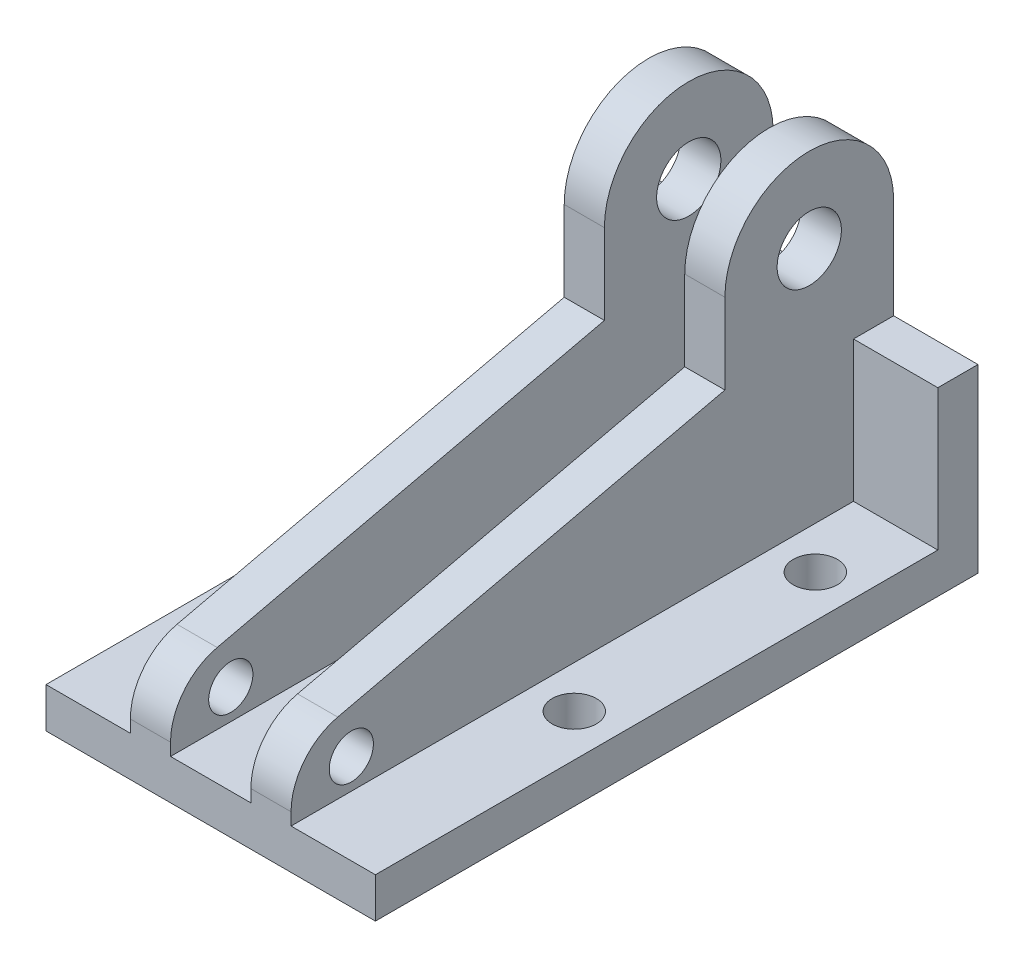
ISO-10303-21;
HEADER;
FILE_DESCRIPTION(('STEP AP214'),'2;1');
FILE_NAME('part.step','',(''),(''),'','','');
FILE_SCHEMA(('AUTOMOTIVE_DESIGN { 1 0 10303 214 1 1 1 1 }'));
ENDSEC;
DATA;
#1=APPLICATION_CONTEXT('core data for automotive mechanical design processes');
#2=APPLICATION_PROTOCOL_DEFINITION('international standard','automotive_design',2000,#1);
#3=PRODUCT_CONTEXT('',#1,'mechanical');
#4=PRODUCT('Part','Part','',(#3));
#5=PRODUCT_RELATED_PRODUCT_CATEGORY('part','',(#4));
#6=PRODUCT_DEFINITION_FORMATION('','',#4);
#7=PRODUCT_DEFINITION_CONTEXT('part definition',#1,'design');
#8=PRODUCT_DEFINITION('design','',#6,#7);
#9=PRODUCT_DEFINITION_SHAPE('','',#8);
#10=(LENGTH_UNIT() NAMED_UNIT(*) SI_UNIT(.MILLI.,.METRE.));
#11=(NAMED_UNIT(*) PLANE_ANGLE_UNIT() SI_UNIT($,.RADIAN.));
#12=(NAMED_UNIT(*) SI_UNIT($,.STERADIAN.) SOLID_ANGLE_UNIT());
#13=UNCERTAINTY_MEASURE_WITH_UNIT(LENGTH_MEASURE(1.E-05),#10,'distance_accuracy_value','');
#14=(GEOMETRIC_REPRESENTATION_CONTEXT(3) GLOBAL_UNCERTAINTY_ASSIGNED_CONTEXT((#13)) GLOBAL_UNIT_ASSIGNED_CONTEXT((#10,
#11,#12)) REPRESENTATION_CONTEXT('',''));
#15=CARTESIAN_POINT('',(0.,0.,0.));
#16=DIRECTION('',(0.,0.,1.));
#17=DIRECTION('',(1.,0.,0.));
#18=AXIS2_PLACEMENT_3D('',#15,#16,#17);
#19=CARTESIAN_POINT('',(41.,0.,0.));
#20=DIRECTION('',(0.,-1.,0.));
#21=DIRECTION('',(0.,0.,-1.));
#22=AXIS2_PLACEMENT_3D('',#19,#20,#21);
#23=PLANE('',#22);
#24=DIRECTION('',(0.,0.,-1.));
#25=VECTOR('',#24,1.);
#26=CARTESIAN_POINT('',(-10.,0.,10.));
#27=LINE('',#26,#25);
#28=CARTESIAN_POINT('',(-10.,0.,10.));
#29=VERTEX_POINT('',#28);
#30=CARTESIAN_POINT('',(-10.,0.,0.));
#31=VERTEX_POINT('',#30);
#32=EDGE_CURVE('E256',#29,#31,#27,.T.);
#33=ORIENTED_EDGE('',*,*,#32,.F.);
#34=DIRECTION('',(-1.,0.,0.));
#35=VECTOR('',#34,1.);
#36=CARTESIAN_POINT('',(41.,0.,10.));
#37=LINE('',#36,#35);
#38=CARTESIAN_POINT('',(10.,0.,10.));
#39=VERTEX_POINT('',#38);
#40=EDGE_CURVE('E369',#39,#29,#37,.T.);
#41=ORIENTED_EDGE('',*,*,#40,.F.);
#42=DIRECTION('',(0.,0.,-1.));
#43=VECTOR('',#42,1.);
#44=CARTESIAN_POINT('',(10.,0.,10.));
#45=LINE('',#44,#43);
#46=CARTESIAN_POINT('',(10.,0.,0.));
#47=VERTEX_POINT('',#46);
#48=EDGE_CURVE('E299',#39,#47,#45,.T.);
#49=ORIENTED_EDGE('',*,*,#48,.T.);
#50=DIRECTION('',(-1.,0.,0.));
#51=VECTOR('',#50,1.);
#52=CARTESIAN_POINT('',(41.,0.,0.));
#53=LINE('',#52,#51);
#54=EDGE_CURVE('E374',#47,#31,#53,.T.);
#55=ORIENTED_EDGE('',*,*,#54,.T.);
#56=EDGE_LOOP('',(#33,#41,#49,#55));
#57=FACE_BOUND('',#56,.T.);
#58=ADVANCED_FACE('F39',(#57),#23,.F.);
#59=CARTESIAN_POINT('',(41.,0.,10.));
#60=DIRECTION('',(0.,0.,-1.));
#61=DIRECTION('',(0.,1.,0.));
#62=AXIS2_PLACEMENT_3D('',#59,#60,#61);
#63=PLANE('',#62);
#64=DIRECTION('',(0.,1.,0.));
#65=VECTOR('',#64,1.);
#66=CARTESIAN_POINT('',(-10.,-35.,10.));
#67=LINE('',#66,#65);
#68=CARTESIAN_POINT('',(-10.,-35.,10.));
#69=VERTEX_POINT('',#68);
#70=EDGE_CURVE('E259',#69,#29,#67,.T.);
#71=ORIENTED_EDGE('',*,*,#70,.F.);
#72=DIRECTION('',(-1.,0.,0.));
#73=VECTOR('',#72,1.);
#74=CARTESIAN_POINT('',(41.,-35.,10.));
#75=LINE('',#74,#73);
#76=CARTESIAN_POINT('',(10.,-35.,10.));
#77=VERTEX_POINT('',#76);
#78=EDGE_CURVE('E364',#77,#69,#75,.T.);
#79=ORIENTED_EDGE('',*,*,#78,.F.);
#80=DIRECTION('',(0.,1.,0.));
#81=VECTOR('',#80,1.);
#82=CARTESIAN_POINT('',(10.,-35.,10.));
#83=LINE('',#82,#81);
#84=EDGE_CURVE('E296',#77,#39,#83,.T.);
#85=ORIENTED_EDGE('',*,*,#84,.T.);
#86=ORIENTED_EDGE('',*,*,#40,.T.);
#87=EDGE_LOOP('',(#71,#79,#85,#86));
#88=FACE_BOUND('',#87,.T.);
#89=ADVANCED_FACE('F417',(#88),#63,.F.);
#90=CARTESIAN_POINT('',(41.,-35.,10.));
#91=DIRECTION('',(0.,-1.,0.));
#92=DIRECTION('',(0.,0.,-1.));
#93=AXIS2_PLACEMENT_3D('',#90,#91,#92);
#94=PLANE('',#93);
#95=DIRECTION('',(0.,0.,-1.));
#96=VECTOR('',#95,1.);
#97=CARTESIAN_POINT('',(-10.,-35.,150.));
#98=LINE('',#97,#96);
#99=CARTESIAN_POINT('',(-10.,-35.,150.));
#100=VERTEX_POINT('',#99);
#101=EDGE_CURVE('E242',#100,#69,#98,.T.);
#102=ORIENTED_EDGE('',*,*,#101,.F.);
#103=DIRECTION('',(-1.,0.,0.));
#104=VECTOR('',#103,1.);
#105=CARTESIAN_POINT('',(41.,-35.,150.));
#106=LINE('',#105,#104);
#107=CARTESIAN_POINT('',(10.,-35.,150.));
#108=VERTEX_POINT('',#107);
#109=EDGE_CURVE('E359',#108,#100,#106,.T.);
#110=ORIENTED_EDGE('',*,*,#109,.F.);
#111=DIRECTION('',(0.,0.,-1.));
#112=VECTOR('',#111,1.);
#113=CARTESIAN_POINT('',(10.,-35.,150.));
#114=LINE('',#113,#112);
#115=EDGE_CURVE('E273',#108,#77,#114,.T.);
#116=ORIENTED_EDGE('',*,*,#115,.T.);
#117=ORIENTED_EDGE('',*,*,#78,.T.);
#118=EDGE_LOOP('',(#102,#110,#116,#117));
#119=FACE_BOUND('',#118,.T.);
#120=ADVANCED_FACE('F419',(#119),#94,.F.);
#121=CARTESIAN_POINT('',(-20.,0.,10.));
#122=VERTEX_POINT('',#121);
#123=CARTESIAN_POINT('',(-41.,0.,10.));
#124=VERTEX_POINT('',#123);
#125=EDGE_CURVE('E363',#122,#124,#37,.T.);
#126=ORIENTED_EDGE('',*,*,#125,.F.);
#127=DIRECTION('',(0.,0.,-1.));
#128=VECTOR('',#127,1.);
#129=CARTESIAN_POINT('',(-20.,0.,10.));
#130=LINE('',#129,#128);
#131=CARTESIAN_POINT('',(-20.,0.,0.));
#132=VERTEX_POINT('',#131);
#133=EDGE_CURVE('E235',#122,#132,#130,.T.);
#134=ORIENTED_EDGE('',*,*,#133,.T.);
#135=CARTESIAN_POINT('',(-41.,0.,0.));
#136=VERTEX_POINT('',#135);
#137=EDGE_CURVE('E368',#132,#136,#53,.T.);
#138=ORIENTED_EDGE('',*,*,#137,.T.);
#139=DIRECTION('',(0.,0.,1.));
#140=VECTOR('',#139,1.);
#141=CARTESIAN_POINT('',(-41.,0.,0.));
#142=LINE('',#141,#140);
#143=EDGE_CURVE('E337',#136,#124,#142,.T.);
#144=ORIENTED_EDGE('',*,*,#143,.T.);
#145=EDGE_LOOP('',(#126,#134,#138,#144));
#146=FACE_BOUND('',#145,.T.);
#147=ADVANCED_FACE('F490',(#146),#23,.F.);
#148=CARTESIAN_POINT('',(-20.,-35.,10.));
#149=VERTEX_POINT('',#148);
#150=CARTESIAN_POINT('',(-41.,-35.,10.));
#151=VERTEX_POINT('',#150);
#152=EDGE_CURVE('E358',#149,#151,#75,.T.);
#153=ORIENTED_EDGE('',*,*,#152,.F.);
#154=DIRECTION('',(0.,1.,0.));
#155=VECTOR('',#154,1.);
#156=CARTESIAN_POINT('',(-20.,-35.,10.));
#157=LINE('',#156,#155);
#158=EDGE_CURVE('E238',#149,#122,#157,.T.);
#159=ORIENTED_EDGE('',*,*,#158,.T.);
#160=ORIENTED_EDGE('',*,*,#125,.T.);
#161=DIRECTION('',(0.,-1.,0.));
#162=VECTOR('',#161,1.);
#163=CARTESIAN_POINT('',(-41.,0.,10.));
#164=LINE('',#163,#162);
#165=EDGE_CURVE('E340',#124,#151,#164,.T.);
#166=ORIENTED_EDGE('',*,*,#165,.T.);
#167=EDGE_LOOP('',(#153,#159,#160,#166));
#168=FACE_BOUND('',#167,.T.);
#169=ADVANCED_FACE('F429',(#168),#63,.F.);
#170=CARTESIAN_POINT('',(-30.5,-35.,30.));
#171=DIRECTION('',(0.,1.,0.));
#172=DIRECTION('',(0.,0.,1.));
#173=AXIS2_PLACEMENT_3D('',#170,#171,#172);
#174=CIRCLE('',#173,5.5);
#175=CARTESIAN_POINT('',(-30.5,-35.,35.5));
#176=VERTEX_POINT('',#175);
#177=EDGE_CURVE('E806',#176,#176,#174,.T.);
#178=ORIENTED_EDGE('',*,*,#177,.F.);
#179=EDGE_LOOP('',(#178));
#180=FACE_BOUND('',#179,.T.);
#181=CARTESIAN_POINT('',(-30.5,-35.,90.));
#182=DIRECTION('',(0.,1.,0.));
#183=DIRECTION('',(0.,0.,1.));
#184=AXIS2_PLACEMENT_3D('',#181,#182,#183);
#185=CIRCLE('',#184,5.5);
#186=CARTESIAN_POINT('',(-30.5,-35.,95.5));
#187=VERTEX_POINT('',#186);
#188=EDGE_CURVE('E798',#187,#187,#185,.T.);
#189=ORIENTED_EDGE('',*,*,#188,.F.);
#190=EDGE_LOOP('',(#189));
#191=FACE_BOUND('',#190,.T.);
#192=CARTESIAN_POINT('',(-20.,-35.,150.));
#193=VERTEX_POINT('',#192);
#194=CARTESIAN_POINT('',(-41.,-35.,150.));
#195=VERTEX_POINT('',#194);
#196=EDGE_CURVE('E354',#193,#195,#106,.T.);
#197=ORIENTED_EDGE('',*,*,#196,.F.);
#198=DIRECTION('',(0.,0.,-1.));
#199=VECTOR('',#198,1.);
#200=CARTESIAN_POINT('',(-20.,-35.,150.));
#201=LINE('',#200,#199);
#202=EDGE_CURVE('E261',#193,#149,#201,.T.);
#203=ORIENTED_EDGE('',*,*,#202,.T.);
#204=ORIENTED_EDGE('',*,*,#152,.T.);
#205=DIRECTION('',(0.,0.,1.));
#206=VECTOR('',#205,1.);
#207=CARTESIAN_POINT('',(-41.,-35.,10.));
#208=LINE('',#207,#206);
#209=EDGE_CURVE('E343',#151,#195,#208,.T.);
#210=ORIENTED_EDGE('',*,*,#209,.T.);
#211=EDGE_LOOP('',(#197,#203,#204,#210));
#212=FACE_BOUND('',#211,.T.);
#213=ADVANCED_FACE('F424',(#180,#191,#212),#94,.F.);
#214=CARTESIAN_POINT('',(41.,0.,0.));
#215=DIRECTION('',(0.,0.,1.));
#216=DIRECTION('',(0.,-1.,0.));
#217=AXIS2_PLACEMENT_3D('',#214,#215,#216);
#218=PLANE('',#217);
#219=DIRECTION('',(0.,1.,0.));
#220=VECTOR('',#219,1.);
#221=CARTESIAN_POINT('',(-41.,0.,0.));
#222=LINE('',#221,#220);
#223=CARTESIAN_POINT('',(-41.,-45.,0.));
#224=VERTEX_POINT('',#223);
#225=EDGE_CURVE('E319',#224,#136,#222,.T.);
#226=ORIENTED_EDGE('',*,*,#225,.T.);
#227=ORIENTED_EDGE('',*,*,#137,.F.);
#228=DIRECTION('',(0.,1.,0.));
#229=VECTOR('',#228,1.);
#230=CARTESIAN_POINT('',(-20.,25.,0.));
#231=LINE('',#230,#229);
#232=CARTESIAN_POINT('',(-20.,25.,0.));
#233=VERTEX_POINT('',#232);
#234=EDGE_CURVE('E229',#132,#233,#231,.T.);
#235=ORIENTED_EDGE('',*,*,#234,.T.);
#236=DIRECTION('',(1.,0.,0.));
#237=VECTOR('',#236,1.);
#238=CARTESIAN_POINT('',(-20.,25.,0.));
#239=LINE('',#238,#237);
#240=CARTESIAN_POINT('',(-10.,25.,0.));
#241=VERTEX_POINT('',#240);
#242=EDGE_CURVE('E241',#233,#241,#239,.T.);
#243=ORIENTED_EDGE('',*,*,#242,.T.);
#244=DIRECTION('',(0.,1.,0.));
#245=VECTOR('',#244,1.);
#246=CARTESIAN_POINT('',(-10.,25.,0.));
#247=LINE('',#246,#245);
#248=EDGE_CURVE('E253',#31,#241,#247,.T.);
#249=ORIENTED_EDGE('',*,*,#248,.F.);
#250=ORIENTED_EDGE('',*,*,#54,.F.);
#251=DIRECTION('',(0.,1.,0.));
#252=VECTOR('',#251,1.);
#253=CARTESIAN_POINT('',(10.,25.,0.));
#254=LINE('',#253,#252);
#255=CARTESIAN_POINT('',(10.,25.,0.));
#256=VERTEX_POINT('',#255);
#257=EDGE_CURVE('E302',#47,#256,#254,.T.);
#258=ORIENTED_EDGE('',*,*,#257,.T.);
#259=DIRECTION('',(-1.,0.,0.));
#260=VECTOR('',#259,1.);
#261=CARTESIAN_POINT('',(20.,25.,0.));
#262=LINE('',#261,#260);
#263=CARTESIAN_POINT('',(20.,25.,0.));
#264=VERTEX_POINT('',#263);
#265=EDGE_CURVE('E316',#264,#256,#262,.T.);
#266=ORIENTED_EDGE('',*,*,#265,.F.);
#267=DIRECTION('',(0.,1.,0.));
#268=VECTOR('',#267,1.);
#269=CARTESIAN_POINT('',(20.,25.,0.));
#270=LINE('',#269,#268);
#271=CARTESIAN_POINT('',(20.,0.,0.));
#272=VERTEX_POINT('',#271);
#273=EDGE_CURVE('E283',#272,#264,#270,.T.);
#274=ORIENTED_EDGE('',*,*,#273,.F.);
#275=CARTESIAN_POINT('',(41.,0.,0.));
#276=VERTEX_POINT('',#275);
#277=EDGE_CURVE('E370',#276,#272,#53,.T.);
#278=ORIENTED_EDGE('',*,*,#277,.F.);
#279=DIRECTION('',(0.,1.,0.));
#280=VECTOR('',#279,1.);
#281=CARTESIAN_POINT('',(41.,0.,0.));
#282=LINE('',#281,#280);
#283=CARTESIAN_POINT('',(41.,-45.,0.));
#284=VERTEX_POINT('',#283);
#285=EDGE_CURVE('E320',#284,#276,#282,.T.);
#286=ORIENTED_EDGE('',*,*,#285,.F.);
#287=DIRECTION('',(-1.,0.,0.));
#288=VECTOR('',#287,1.);
#289=CARTESIAN_POINT('',(41.,-45.,0.));
#290=LINE('',#289,#288);
#291=EDGE_CURVE('E334',#284,#224,#290,.T.);
#292=ORIENTED_EDGE('',*,*,#291,.T.);
#293=EDGE_LOOP('',(#226,#227,#235,#243,#249,#250,#258,#266,#274,#278,#286,#292));
#294=FACE_BOUND('',#293,.T.);
#295=ADVANCED_FACE('F401',(#294),#218,.F.);
#296=ORIENTED_EDGE('',*,*,#277,.T.);
#297=DIRECTION('',(0.,0.,-1.));
#298=VECTOR('',#297,1.);
#299=CARTESIAN_POINT('',(20.,0.,10.));
#300=LINE('',#299,#298);
#301=CARTESIAN_POINT('',(20.,0.,10.));
#302=VERTEX_POINT('',#301);
#303=EDGE_CURVE('E281',#302,#272,#300,.T.);
#304=ORIENTED_EDGE('',*,*,#303,.F.);
#305=CARTESIAN_POINT('',(41.,0.,10.));
#306=VERTEX_POINT('',#305);
#307=EDGE_CURVE('E365',#306,#302,#37,.T.);
#308=ORIENTED_EDGE('',*,*,#307,.F.);
#309=DIRECTION('',(0.,0.,1.));
#310=VECTOR('',#309,1.);
#311=CARTESIAN_POINT('',(41.,0.,0.));
#312=LINE('',#311,#310);
#313=EDGE_CURVE('E323',#276,#306,#312,.T.);
#314=ORIENTED_EDGE('',*,*,#313,.F.);
#315=EDGE_LOOP('',(#296,#304,#308,#314));
#316=FACE_BOUND('',#315,.T.);
#317=ADVANCED_FACE('F462',(#316),#23,.F.);
#318=ORIENTED_EDGE('',*,*,#307,.T.);
#319=DIRECTION('',(0.,1.,0.));
#320=VECTOR('',#319,1.);
#321=CARTESIAN_POINT('',(20.,-35.,10.));
#322=LINE('',#321,#320);
#323=CARTESIAN_POINT('',(20.,-35.,10.));
#324=VERTEX_POINT('',#323);
#325=EDGE_CURVE('E278',#324,#302,#322,.T.);
#326=ORIENTED_EDGE('',*,*,#325,.F.);
#327=CARTESIAN_POINT('',(41.,-35.,10.));
#328=VERTEX_POINT('',#327);
#329=EDGE_CURVE('E360',#328,#324,#75,.T.);
#330=ORIENTED_EDGE('',*,*,#329,.F.);
#331=DIRECTION('',(0.,-1.,0.));
#332=VECTOR('',#331,1.);
#333=CARTESIAN_POINT('',(41.,0.,10.));
#334=LINE('',#333,#332);
#335=EDGE_CURVE('E326',#306,#328,#334,.T.);
#336=ORIENTED_EDGE('',*,*,#335,.F.);
#337=EDGE_LOOP('',(#318,#326,#330,#336));
#338=FACE_BOUND('',#337,.T.);
#339=ADVANCED_FACE('F458',(#338),#63,.F.);
#340=CARTESIAN_POINT('',(30.5,-35.,90.));
#341=DIRECTION('',(0.,1.,0.));
#342=DIRECTION('',(0.,0.,1.));
#343=AXIS2_PLACEMENT_3D('',#340,#341,#342);
#344=CIRCLE('',#343,5.5);
#345=CARTESIAN_POINT('',(30.5,-35.,95.5));
#346=VERTEX_POINT('',#345);
#347=EDGE_CURVE('E792',#346,#346,#344,.T.);
#348=ORIENTED_EDGE('',*,*,#347,.F.);
#349=EDGE_LOOP('',(#348));
#350=FACE_BOUND('',#349,.T.);
#351=CARTESIAN_POINT('',(30.5,-35.,30.));
#352=DIRECTION('',(0.,1.,0.));
#353=DIRECTION('',(0.,0.,1.));
#354=AXIS2_PLACEMENT_3D('',#351,#352,#353);
#355=CIRCLE('',#354,5.5);
#356=CARTESIAN_POINT('',(30.5,-35.,35.5));
#357=VERTEX_POINT('',#356);
#358=EDGE_CURVE('E795',#357,#357,#355,.T.);
#359=ORIENTED_EDGE('',*,*,#358,.F.);
#360=EDGE_LOOP('',(#359));
#361=FACE_BOUND('',#360,.T.);
#362=ORIENTED_EDGE('',*,*,#329,.T.);
#363=DIRECTION('',(0.,0.,-1.));
#364=VECTOR('',#363,1.);
#365=CARTESIAN_POINT('',(20.,-35.,150.));
#366=LINE('',#365,#364);
#367=CARTESIAN_POINT('',(20.,-35.,150.));
#368=VERTEX_POINT('',#367);
#369=EDGE_CURVE('E276',#368,#324,#366,.T.);
#370=ORIENTED_EDGE('',*,*,#369,.F.);
#371=CARTESIAN_POINT('',(41.,-35.,150.));
#372=VERTEX_POINT('',#371);
#373=EDGE_CURVE('E355',#372,#368,#106,.T.);
#374=ORIENTED_EDGE('',*,*,#373,.F.);
#375=DIRECTION('',(0.,0.,1.));
#376=VECTOR('',#375,1.);
#377=CARTESIAN_POINT('',(41.,-35.,10.));
#378=LINE('',#377,#376);
#379=EDGE_CURVE('E328',#328,#372,#378,.T.);
#380=ORIENTED_EDGE('',*,*,#379,.F.);
#381=EDGE_LOOP('',(#362,#370,#374,#380));
#382=FACE_BOUND('',#381,.T.);
#383=ADVANCED_FACE('F450',(#350,#361,#382),#94,.F.);
#384=CARTESIAN_POINT('',(41.,-45.,150.));
#385=DIRECTION('',(0.,0.,-1.));
#386=DIRECTION('',(-1.,0.,0.));
#387=AXIS2_PLACEMENT_3D('',#384,#385,#386);
#388=PLANE('',#387);
#389=DIRECTION('',(0.,-1.,0.));
#390=VECTOR('',#389,1.);
#391=CARTESIAN_POINT('',(-10.,-35.,150.));
#392=LINE('',#391,#390);
#393=CARTESIAN_POINT('',(-10.,-31.9244114085587,150.));
#394=VERTEX_POINT('',#393);
#395=EDGE_CURVE('E244',#394,#100,#392,.T.);
#396=ORIENTED_EDGE('',*,*,#395,.F.);
#397=DIRECTION('',(1.,0.,0.));
#398=VECTOR('',#397,1.);
#399=CARTESIAN_POINT('',(-20.,-31.9244114085587,150.));
#400=LINE('',#399,#398);
#401=CARTESIAN_POINT('',(-20.,-31.9244114085587,150.));
#402=VERTEX_POINT('',#401);
#403=EDGE_CURVE('E381',#394,#402,#400,.F.);
#404=ORIENTED_EDGE('',*,*,#403,.T.);
#405=DIRECTION('',(0.,-1.,0.));
#406=VECTOR('',#405,1.);
#407=CARTESIAN_POINT('',(-20.,-35.,150.));
#408=LINE('',#407,#406);
#409=EDGE_CURVE('E224',#402,#193,#408,.T.);
#410=ORIENTED_EDGE('',*,*,#409,.T.);
#411=ORIENTED_EDGE('',*,*,#196,.T.);
#412=DIRECTION('',(0.,-1.,0.));
#413=VECTOR('',#412,1.);
#414=CARTESIAN_POINT('',(-41.,-45.,150.));
#415=LINE('',#414,#413);
#416=CARTESIAN_POINT('',(-41.,-45.,150.));
#417=VERTEX_POINT('',#416);
#418=EDGE_CURVE('E346',#195,#417,#415,.T.);
#419=ORIENTED_EDGE('',*,*,#418,.T.);
#420=DIRECTION('',(-1.,0.,0.));
#421=VECTOR('',#420,1.);
#422=CARTESIAN_POINT('',(41.,-45.,150.));
#423=LINE('',#422,#421);
#424=CARTESIAN_POINT('',(41.,-45.,150.));
#425=VERTEX_POINT('',#424);
#426=EDGE_CURVE('E351',#425,#417,#423,.T.);
#427=ORIENTED_EDGE('',*,*,#426,.F.);
#428=DIRECTION('',(0.,-1.,0.));
#429=VECTOR('',#428,1.);
#430=CARTESIAN_POINT('',(41.,-45.,150.));
#431=LINE('',#430,#429);
#432=EDGE_CURVE('E330',#372,#425,#431,.T.);
#433=ORIENTED_EDGE('',*,*,#432,.F.);
#434=ORIENTED_EDGE('',*,*,#373,.T.);
#435=DIRECTION('',(0.,-1.,0.));
#436=VECTOR('',#435,1.);
#437=CARTESIAN_POINT('',(20.,-35.,150.));
#438=LINE('',#437,#436);
#439=CARTESIAN_POINT('',(20.,-31.9244114085587,150.));
#440=VERTEX_POINT('',#439);
#441=EDGE_CURVE('E291',#440,#368,#438,.T.);
#442=ORIENTED_EDGE('',*,*,#441,.F.);
#443=DIRECTION('',(-1.,0.,0.));
#444=VECTOR('',#443,1.);
#445=CARTESIAN_POINT('',(41.,-31.9244114085587,150.));
#446=LINE('',#445,#444);
#447=CARTESIAN_POINT('',(10.,-31.9244114085587,150.));
#448=VERTEX_POINT('',#447);
#449=EDGE_CURVE('E378',#440,#448,#446,.T.);
#450=ORIENTED_EDGE('',*,*,#449,.T.);
#451=DIRECTION('',(0.,-1.,0.));
#452=VECTOR('',#451,1.);
#453=CARTESIAN_POINT('',(10.,-35.,150.));
#454=LINE('',#453,#452);
#455=EDGE_CURVE('E279',#448,#108,#454,.T.);
#456=ORIENTED_EDGE('',*,*,#455,.T.);
#457=ORIENTED_EDGE('',*,*,#109,.T.);
#458=EDGE_LOOP('',(#396,#404,#410,#411,#419,#427,#433,#434,#442,#450,#456,#457));
#459=FACE_BOUND('',#458,.T.);
#460=ADVANCED_FACE('F387',(#459),#388,.F.);
#461=CARTESIAN_POINT('',(41.,-45.,0.));
#462=DIRECTION('',(0.,1.,0.));
#463=DIRECTION('',(0.,0.,1.));
#464=AXIS2_PLACEMENT_3D('',#461,#462,#463);
#465=PLANE('',#464);
#466=CARTESIAN_POINT('',(-30.5,-45.,30.));
#467=DIRECTION('',(0.,1.,0.));
#468=DIRECTION('',(0.,0.,1.));
#469=AXIS2_PLACEMENT_3D('',#466,#467,#468);
#470=CIRCLE('',#469,5.5);
#471=CARTESIAN_POINT('',(-30.5,-45.,35.5));
#472=VERTEX_POINT('',#471);
#473=EDGE_CURVE('E803',#472,#472,#470,.T.);
#474=ORIENTED_EDGE('',*,*,#473,.T.);
#475=EDGE_LOOP('',(#474));
#476=FACE_BOUND('',#475,.T.);
#477=CARTESIAN_POINT('',(-30.5,-45.,90.));
#478=DIRECTION('',(0.,1.,0.));
#479=DIRECTION('',(0.,0.,1.));
#480=AXIS2_PLACEMENT_3D('',#477,#478,#479);
#481=CIRCLE('',#480,5.5);
#482=CARTESIAN_POINT('',(-30.5,-45.,95.5));
#483=VERTEX_POINT('',#482);
#484=EDGE_CURVE('E793',#483,#483,#481,.T.);
#485=ORIENTED_EDGE('',*,*,#484,.T.);
#486=EDGE_LOOP('',(#485));
#487=FACE_BOUND('',#486,.T.);
#488=CARTESIAN_POINT('',(30.5,-45.,90.));
#489=DIRECTION('',(0.,1.,0.));
#490=DIRECTION('',(0.,0.,1.));
#491=AXIS2_PLACEMENT_3D('',#488,#489,#490);
#492=CIRCLE('',#491,5.5);
#493=CARTESIAN_POINT('',(30.5,-45.,95.5));
#494=VERTEX_POINT('',#493);
#495=EDGE_CURVE('E790',#494,#494,#492,.T.);
#496=ORIENTED_EDGE('',*,*,#495,.T.);
#497=EDGE_LOOP('',(#496));
#498=FACE_BOUND('',#497,.T.);
#499=CARTESIAN_POINT('',(30.5,-45.,30.));
#500=DIRECTION('',(0.,1.,0.));
#501=DIRECTION('',(0.,0.,1.));
#502=AXIS2_PLACEMENT_3D('',#499,#500,#501);
#503=CIRCLE('',#502,5.5);
#504=CARTESIAN_POINT('',(30.5,-45.,35.5));
#505=VERTEX_POINT('',#504);
#506=EDGE_CURVE('E809',#505,#505,#503,.T.);
#507=ORIENTED_EDGE('',*,*,#506,.T.);
#508=EDGE_LOOP('',(#507));
#509=FACE_BOUND('',#508,.T.);
#510=DIRECTION('',(0.,0.,-1.));
#511=VECTOR('',#510,1.);
#512=CARTESIAN_POINT('',(-41.,-45.,0.));
#513=LINE('',#512,#511);
#514=EDGE_CURVE('E324',#417,#224,#513,.T.);
#515=ORIENTED_EDGE('',*,*,#514,.T.);
#516=ORIENTED_EDGE('',*,*,#291,.F.);
#517=DIRECTION('',(0.,0.,-1.));
#518=VECTOR('',#517,1.);
#519=CARTESIAN_POINT('',(41.,-45.,0.));
#520=LINE('',#519,#518);
#521=EDGE_CURVE('E332',#425,#284,#520,.T.);
#522=ORIENTED_EDGE('',*,*,#521,.F.);
#523=ORIENTED_EDGE('',*,*,#426,.T.);
#524=EDGE_LOOP('',(#515,#516,#522,#523));
#525=FACE_BOUND('',#524,.T.);
#526=ADVANCED_FACE('F438',(#476,#487,#498,#509,#525),#465,.F.);
#527=CARTESIAN_POINT('',(41.,0.,0.));
#528=DIRECTION('',(-1.,0.,0.));
#529=DIRECTION('',(0.,0.,1.));
#530=AXIS2_PLACEMENT_3D('',#527,#528,#529);
#531=PLANE('',#530);
#532=ORIENTED_EDGE('',*,*,#285,.T.);
#533=ORIENTED_EDGE('',*,*,#313,.T.);
#534=ORIENTED_EDGE('',*,*,#335,.T.);
#535=ORIENTED_EDGE('',*,*,#379,.T.);
#536=ORIENTED_EDGE('',*,*,#432,.T.);
#537=ORIENTED_EDGE('',*,*,#521,.T.);
#538=EDGE_LOOP('',(#532,#533,#534,#535,#536,#537));
#539=FACE_BOUND('',#538,.T.);
#540=ADVANCED_FACE('F442',(#539),#531,.F.);
#541=CARTESIAN_POINT('',(-41.,0.,0.));
#542=DIRECTION('',(-1.,0.,0.));
#543=DIRECTION('',(0.,0.,1.));
#544=AXIS2_PLACEMENT_3D('',#541,#542,#543);
#545=PLANE('',#544);
#546=ORIENTED_EDGE('',*,*,#225,.F.);
#547=ORIENTED_EDGE('',*,*,#514,.F.);
#548=ORIENTED_EDGE('',*,*,#418,.F.);
#549=ORIENTED_EDGE('',*,*,#209,.F.);
#550=ORIENTED_EDGE('',*,*,#165,.F.);
#551=ORIENTED_EDGE('',*,*,#143,.F.);
#552=EDGE_LOOP('',(#546,#547,#548,#549,#550,#551));
#553=FACE_BOUND('',#552,.T.);
#554=ADVANCED_FACE('F432',(#553),#545,.T.);
#555=CARTESIAN_POINT('',(20.,25.,21.));
#556=DIRECTION('',(1.,0.,0.));
#557=DIRECTION('',(0.,0.,-1.));
#558=AXIS2_PLACEMENT_3D('',#555,#556,#557);
#559=PLANE('',#558);
#560=CARTESIAN_POINT('',(20.,25.,21.));
#561=DIRECTION('',(1.,0.,0.));
#562=DIRECTION('',(0.,0.,-1.));
#563=AXIS2_PLACEMENT_3D('',#560,#561,#562);
#564=CIRCLE('',#563,8.);
#565=CARTESIAN_POINT('',(20.,25.,13.));
#566=VERTEX_POINT('',#565);
#567=EDGE_CURVE('E270',#566,#566,#564,.T.);
#568=ORIENTED_EDGE('',*,*,#567,.F.);
#569=EDGE_LOOP('',(#568));
#570=FACE_BOUND('',#569,.T.);
#571=DIRECTION('',(0.,-0.225518272726875,0.974238938180099));
#572=VECTOR('',#571,1.);
#573=CARTESIAN_POINT('',(20.,-20.,150.));
#574=LINE('',#573,#572);
#575=CARTESIAN_POINT('',(20.,5.,42.));
#576=VERTEX_POINT('',#575);
#577=CARTESIAN_POINT('',(20.,-17.3108273358572,138.382774090903));
#578=VERTEX_POINT('',#577);
#579=EDGE_CURVE('E289',#576,#578,#574,.T.);
#580=ORIENTED_EDGE('',*,*,#579,.T.);
#581=CARTESIAN_POINT('',(20.,-31.9244114085587,135.));
#582=DIRECTION('',(1.,0.,0.));
#583=DIRECTION('',(0.,0.,-1.));
#584=AXIS2_PLACEMENT_3D('',#581,#582,#583);
#585=CIRCLE('',#584,15.);
#586=EDGE_CURVE('E11',#578,#440,#585,.T.);
#587=ORIENTED_EDGE('',*,*,#586,.T.);
#588=ORIENTED_EDGE('',*,*,#441,.T.);
#589=ORIENTED_EDGE('',*,*,#369,.T.);
#590=ORIENTED_EDGE('',*,*,#325,.T.);
#591=ORIENTED_EDGE('',*,*,#303,.T.);
#592=ORIENTED_EDGE('',*,*,#273,.T.);
#593=CARTESIAN_POINT('',(20.,25.,21.));
#594=DIRECTION('',(1.,0.,0.));
#595=DIRECTION('',(0.,0.,-1.));
#596=AXIS2_PLACEMENT_3D('',#593,#594,#595);
#597=CIRCLE('',#596,21.);
#598=CARTESIAN_POINT('',(20.,25.,42.));
#599=VERTEX_POINT('',#598);
#600=EDGE_CURVE('E285',#264,#599,#597,.T.);
#601=ORIENTED_EDGE('',*,*,#600,.T.);
#602=DIRECTION('',(0.,-1.,0.));
#603=VECTOR('',#602,1.);
#604=CARTESIAN_POINT('',(20.,25.,42.));
#605=LINE('',#604,#603);
#606=EDGE_CURVE('E287',#599,#576,#605,.T.);
#607=ORIENTED_EDGE('',*,*,#606,.T.);
#608=EDGE_LOOP('',(#580,#587,#588,#589,#590,#591,#592,#601,#607));
#609=FACE_BOUND('',#608,.T.);
#610=CARTESIAN_POINT('',(20.,-27.5,135.));
#611=DIRECTION('',(1.,0.,0.));
#612=DIRECTION('',(0.,0.,-1.));
#613=AXIS2_PLACEMENT_3D('',#610,#611,#612);
#614=CIRCLE('',#613,5.50000000000002);
#615=CARTESIAN_POINT('',(20.,-27.5,129.5));
#616=VERTEX_POINT('',#615);
#617=EDGE_CURVE('E264',#616,#616,#614,.T.);
#618=ORIENTED_EDGE('',*,*,#617,.F.);
#619=EDGE_LOOP('',(#618));
#620=FACE_BOUND('',#619,.T.);
#621=ADVANCED_FACE('F454',(#570,#609,#620),#559,.T.);
#622=CARTESIAN_POINT('',(10.,25.,21.));
#623=DIRECTION('',(1.,0.,0.));
#624=DIRECTION('',(0.,0.,-1.));
#625=AXIS2_PLACEMENT_3D('',#622,#623,#624);
#626=PLANE('',#625);
#627=ORIENTED_EDGE('',*,*,#455,.F.);
#628=CARTESIAN_POINT('',(10.,-31.9244114085587,135.));
#629=DIRECTION('',(1.,0.,0.));
#630=DIRECTION('',(0.,0.,-1.));
#631=AXIS2_PLACEMENT_3D('',#628,#629,#630);
#632=CIRCLE('',#631,15.);
#633=CARTESIAN_POINT('',(10.,-17.3108273358572,138.382774090903));
#634=VERTEX_POINT('',#633);
#635=EDGE_CURVE('E61',#448,#634,#632,.F.);
#636=ORIENTED_EDGE('',*,*,#635,.T.);
#637=DIRECTION('',(0.,-0.225518272726875,0.974238938180099));
#638=VECTOR('',#637,1.);
#639=CARTESIAN_POINT('',(10.,-20.,150.));
#640=LINE('',#639,#638);
#641=CARTESIAN_POINT('',(10.,5.,42.));
#642=VERTEX_POINT('',#641);
#643=EDGE_CURVE('E308',#642,#634,#640,.T.);
#644=ORIENTED_EDGE('',*,*,#643,.F.);
#645=DIRECTION('',(0.,-1.,0.));
#646=VECTOR('',#645,1.);
#647=CARTESIAN_POINT('',(10.,25.,42.));
#648=LINE('',#647,#646);
#649=CARTESIAN_POINT('',(10.,25.,42.));
#650=VERTEX_POINT('',#649);
#651=EDGE_CURVE('E306',#650,#642,#648,.T.);
#652=ORIENTED_EDGE('',*,*,#651,.F.);
#653=CARTESIAN_POINT('',(10.,25.,21.));
#654=DIRECTION('',(1.,0.,0.));
#655=DIRECTION('',(0.,0.,-1.));
#656=AXIS2_PLACEMENT_3D('',#653,#654,#655);
#657=CIRCLE('',#656,21.);
#658=EDGE_CURVE('E304',#256,#650,#657,.T.);
#659=ORIENTED_EDGE('',*,*,#658,.F.);
#660=ORIENTED_EDGE('',*,*,#257,.F.);
#661=ORIENTED_EDGE('',*,*,#48,.F.);
#662=ORIENTED_EDGE('',*,*,#84,.F.);
#663=ORIENTED_EDGE('',*,*,#115,.F.);
#664=EDGE_LOOP('',(#627,#636,#644,#652,#659,#660,#661,#662,#663));
#665=FACE_BOUND('',#664,.T.);
#666=CARTESIAN_POINT('',(10.,25.,21.));
#667=DIRECTION('',(1.,0.,0.));
#668=DIRECTION('',(0.,0.,-1.));
#669=AXIS2_PLACEMENT_3D('',#666,#667,#668);
#670=CIRCLE('',#669,8.);
#671=CARTESIAN_POINT('',(10.,25.,13.));
#672=VERTEX_POINT('',#671);
#673=EDGE_CURVE('E267',#672,#672,#670,.T.);
#674=ORIENTED_EDGE('',*,*,#673,.T.);
#675=EDGE_LOOP('',(#674));
#676=FACE_BOUND('',#675,.T.);
#677=CARTESIAN_POINT('',(10.,-27.5,135.));
#678=DIRECTION('',(1.,0.,0.));
#679=DIRECTION('',(0.,0.,-1.));
#680=AXIS2_PLACEMENT_3D('',#677,#678,#679);
#681=CIRCLE('',#680,5.50000000000002);
#682=CARTESIAN_POINT('',(10.,-27.5,129.5));
#683=VERTEX_POINT('',#682);
#684=EDGE_CURVE('E212',#683,#683,#681,.T.);
#685=ORIENTED_EDGE('',*,*,#684,.T.);
#686=EDGE_LOOP('',(#685));
#687=FACE_BOUND('',#686,.T.);
#688=ADVANCED_FACE('F555',(#665,#676,#687),#626,.F.);
#689=CARTESIAN_POINT('',(20.,25.,21.));
#690=DIRECTION('',(-1.,0.,0.));
#691=DIRECTION('',(0.,0.,1.));
#692=AXIS2_PLACEMENT_3D('',#689,#690,#691);
#693=CYLINDRICAL_SURFACE('',#692,21.);
#694=ORIENTED_EDGE('',*,*,#658,.T.);
#695=DIRECTION('',(-1.,0.,0.));
#696=VECTOR('',#695,1.);
#697=CARTESIAN_POINT('',(20.,25.,42.));
#698=LINE('',#697,#696);
#699=EDGE_CURVE('E313',#599,#650,#698,.T.);
#700=ORIENTED_EDGE('',*,*,#699,.F.);
#701=ORIENTED_EDGE('',*,*,#600,.F.);
#702=ORIENTED_EDGE('',*,*,#265,.T.);
#703=EDGE_LOOP('',(#694,#700,#701,#702));
#704=FACE_BOUND('',#703,.T.);
#705=ADVANCED_FACE('F468',(#704),#693,.T.);
#706=CARTESIAN_POINT('',(20.,25.,42.));
#707=DIRECTION('',(0.,0.,-1.));
#708=DIRECTION('',(0.,1.,0.));
#709=AXIS2_PLACEMENT_3D('',#706,#707,#708);
#710=PLANE('',#709);
#711=ORIENTED_EDGE('',*,*,#651,.T.);
#712=DIRECTION('',(-1.,0.,0.));
#713=VECTOR('',#712,1.);
#714=CARTESIAN_POINT('',(20.,5.,42.));
#715=LINE('',#714,#713);
#716=EDGE_CURVE('E293',#576,#642,#715,.T.);
#717=ORIENTED_EDGE('',*,*,#716,.F.);
#718=ORIENTED_EDGE('',*,*,#606,.F.);
#719=ORIENTED_EDGE('',*,*,#699,.T.);
#720=EDGE_LOOP('',(#711,#717,#718,#719));
#721=FACE_BOUND('',#720,.T.);
#722=ADVANCED_FACE('F473',(#721),#710,.F.);
#723=CARTESIAN_POINT('',(20.,-20.,150.));
#724=DIRECTION('',(0.,-0.974238938180099,-0.225518272726875));
#725=DIRECTION('',(0.,0.225518272726875,-0.974238938180099));
#726=AXIS2_PLACEMENT_3D('',#723,#724,#725);
#727=PLANE('',#726);
#728=ORIENTED_EDGE('',*,*,#643,.T.);
#729=DIRECTION('',(-1.,0.,0.));
#730=VECTOR('',#729,1.);
#731=CARTESIAN_POINT('',(20.,-17.3108273358572,138.382774090903));
#732=LINE('',#731,#730);
#733=EDGE_CURVE('E47',#634,#578,#732,.F.);
#734=ORIENTED_EDGE('',*,*,#733,.T.);
#735=ORIENTED_EDGE('',*,*,#579,.F.);
#736=ORIENTED_EDGE('',*,*,#716,.T.);
#737=EDGE_LOOP('',(#728,#734,#735,#736));
#738=FACE_BOUND('',#737,.T.);
#739=ADVANCED_FACE('F475',(#738),#727,.F.);
#740=CARTESIAN_POINT('',(20.,25.,21.));
#741=DIRECTION('',(-1.,0.,0.));
#742=DIRECTION('',(0.,0.,1.));
#743=AXIS2_PLACEMENT_3D('',#740,#741,#742);
#744=CYLINDRICAL_SURFACE('',#743,8.);
#745=ORIENTED_EDGE('',*,*,#567,.T.);
#746=EDGE_LOOP('',(#745));
#747=FACE_BOUND('',#746,.T.);
#748=ORIENTED_EDGE('',*,*,#673,.F.);
#749=EDGE_LOOP('',(#748));
#750=FACE_BOUND('',#749,.T.);
#751=ADVANCED_FACE('F477',(#747,#750),#744,.F.);
#752=CARTESIAN_POINT('',(20.,-27.5,135.));
#753=DIRECTION('',(-1.,0.,0.));
#754=DIRECTION('',(0.,0.,1.));
#755=AXIS2_PLACEMENT_3D('',#752,#753,#754);
#756=CYLINDRICAL_SURFACE('',#755,5.50000000000002);
#757=ORIENTED_EDGE('',*,*,#617,.T.);
#758=EDGE_LOOP('',(#757));
#759=FACE_BOUND('',#758,.T.);
#760=ORIENTED_EDGE('',*,*,#684,.F.);
#761=EDGE_LOOP('',(#760));
#762=FACE_BOUND('',#761,.T.);
#763=ADVANCED_FACE('F483',(#759,#762),#756,.F.);
#764=CARTESIAN_POINT('',(-20.,-20.,150.));
#765=DIRECTION('',(0.,0.974238938180099,0.225518272726875));
#766=DIRECTION('',(0.,-0.225518272726875,0.974238938180099));
#767=AXIS2_PLACEMENT_3D('',#764,#765,#766);
#768=PLANE('',#767);
#769=DIRECTION('',(0.,-0.225518272726875,0.974238938180099));
#770=VECTOR('',#769,1.);
#771=CARTESIAN_POINT('',(-20.,-20.,150.));
#772=LINE('',#771,#770);
#773=CARTESIAN_POINT('',(-20.,5.,42.));
#774=VERTEX_POINT('',#773);
#775=CARTESIAN_POINT('',(-20.,-17.3108273358572,138.382774090903));
#776=VERTEX_POINT('',#775);
#777=EDGE_CURVE('E204',#774,#776,#772,.T.);
#778=ORIENTED_EDGE('',*,*,#777,.T.);
#779=DIRECTION('',(1.,0.,0.));
#780=VECTOR('',#779,1.);
#781=CARTESIAN_POINT('',(-10.,-17.3108273358572,138.382774090903));
#782=LINE('',#781,#780);
#783=CARTESIAN_POINT('',(-10.,-17.3108273358572,138.382774090903));
#784=VERTEX_POINT('',#783);
#785=EDGE_CURVE('E373',#776,#784,#782,.T.);
#786=ORIENTED_EDGE('',*,*,#785,.T.);
#787=DIRECTION('',(0.,-0.225518272726875,0.974238938180099));
#788=VECTOR('',#787,1.);
#789=CARTESIAN_POINT('',(-10.,-20.,150.));
#790=LINE('',#789,#788);
#791=CARTESIAN_POINT('',(-10.,5.,42.));
#792=VERTEX_POINT('',#791);
#793=EDGE_CURVE('E207',#792,#784,#790,.T.);
#794=ORIENTED_EDGE('',*,*,#793,.F.);
#795=DIRECTION('',(1.,0.,0.));
#796=VECTOR('',#795,1.);
#797=CARTESIAN_POINT('',(-20.,5.,42.));
#798=LINE('',#797,#796);
#799=EDGE_CURVE('E200',#774,#792,#798,.T.);
#800=ORIENTED_EDGE('',*,*,#799,.F.);
#801=EDGE_LOOP('',(#778,#786,#794,#800));
#802=FACE_BOUND('',#801,.T.);
#803=ADVANCED_FACE('F202',(#802),#768,.T.);
#804=CARTESIAN_POINT('',(-20.,25.,42.));
#805=DIRECTION('',(0.,0.,1.));
#806=DIRECTION('',(0.,-1.,0.));
#807=AXIS2_PLACEMENT_3D('',#804,#805,#806);
#808=PLANE('',#807);
#809=DIRECTION('',(0.,-1.,0.));
#810=VECTOR('',#809,1.);
#811=CARTESIAN_POINT('',(-10.,25.,42.));
#812=LINE('',#811,#810);
#813=CARTESIAN_POINT('',(-10.,25.,42.));
#814=VERTEX_POINT('',#813);
#815=EDGE_CURVE('E248',#814,#792,#812,.T.);
#816=ORIENTED_EDGE('',*,*,#815,.F.);
#817=DIRECTION('',(1.,0.,0.));
#818=VECTOR('',#817,1.);
#819=CARTESIAN_POINT('',(-20.,25.,42.));
#820=LINE('',#819,#818);
#821=CARTESIAN_POINT('',(-20.,25.,42.));
#822=VERTEX_POINT('',#821);
#823=EDGE_CURVE('E213',#822,#814,#820,.T.);
#824=ORIENTED_EDGE('',*,*,#823,.F.);
#825=DIRECTION('',(0.,-1.,0.));
#826=VECTOR('',#825,1.);
#827=CARTESIAN_POINT('',(-20.,25.,42.));
#828=LINE('',#827,#826);
#829=EDGE_CURVE('E220',#822,#774,#828,.T.);
#830=ORIENTED_EDGE('',*,*,#829,.T.);
#831=ORIENTED_EDGE('',*,*,#799,.T.);
#832=EDGE_LOOP('',(#816,#824,#830,#831));
#833=FACE_BOUND('',#832,.T.);
#834=ADVANCED_FACE('F226',(#833),#808,.T.);
#835=CARTESIAN_POINT('',(-20.,25.,21.));
#836=DIRECTION('',(1.,0.,0.));
#837=DIRECTION('',(0.,0.,-1.));
#838=AXIS2_PLACEMENT_3D('',#835,#836,#837);
#839=CYLINDRICAL_SURFACE('',#838,21.);
#840=CARTESIAN_POINT('',(-10.,25.,21.));
#841=DIRECTION('',(1.,0.,0.));
#842=DIRECTION('',(0.,0.,-1.));
#843=AXIS2_PLACEMENT_3D('',#840,#841,#842);
#844=CIRCLE('',#843,21.);
#845=EDGE_CURVE('E250',#241,#814,#844,.T.);
#846=ORIENTED_EDGE('',*,*,#845,.F.);
#847=ORIENTED_EDGE('',*,*,#242,.F.);
#848=CARTESIAN_POINT('',(-20.,25.,21.));
#849=DIRECTION('',(1.,0.,0.));
#850=DIRECTION('',(0.,0.,-1.));
#851=AXIS2_PLACEMENT_3D('',#848,#849,#850);
#852=CIRCLE('',#851,21.);
#853=EDGE_CURVE('E227',#233,#822,#852,.T.);
#854=ORIENTED_EDGE('',*,*,#853,.T.);
#855=ORIENTED_EDGE('',*,*,#823,.T.);
#856=EDGE_LOOP('',(#846,#847,#854,#855));
#857=FACE_BOUND('',#856,.T.);
#858=ADVANCED_FACE('F398',(#857),#839,.T.);
#859=CARTESIAN_POINT('',(-20.,25.,21.));
#860=DIRECTION('',(-1.,0.,0.));
#861=DIRECTION('',(0.,0.,-1.));
#862=AXIS2_PLACEMENT_3D('',#859,#860,#861);
#863=PLANE('',#862);
#864=CARTESIAN_POINT('',(-20.,-27.5,135.));
#865=DIRECTION('',(1.,0.,0.));
#866=DIRECTION('',(0.,0.,-1.));
#867=AXIS2_PLACEMENT_3D('',#864,#865,#866);
#868=CIRCLE('',#867,5.50000000000002);
#869=CARTESIAN_POINT('',(-20.,-27.5,129.5));
#870=VERTEX_POINT('',#869);
#871=EDGE_CURVE('E815',#870,#870,#868,.T.);
#872=ORIENTED_EDGE('',*,*,#871,.T.);
#873=EDGE_LOOP('',(#872));
#874=FACE_BOUND('',#873,.T.);
#875=CARTESIAN_POINT('',(-20.,25.,21.));
#876=DIRECTION('',(1.,0.,0.));
#877=DIRECTION('',(0.,0.,-1.));
#878=AXIS2_PLACEMENT_3D('',#875,#876,#877);
#879=CIRCLE('',#878,8.);
#880=CARTESIAN_POINT('',(-20.,25.,13.));
#881=VERTEX_POINT('',#880);
#882=EDGE_CURVE('E245',#881,#881,#879,.T.);
#883=ORIENTED_EDGE('',*,*,#882,.T.);
#884=EDGE_LOOP('',(#883));
#885=FACE_BOUND('',#884,.T.);
#886=ORIENTED_EDGE('',*,*,#409,.F.);
#887=CARTESIAN_POINT('',(-20.,-31.9244114085587,135.));
#888=DIRECTION('',(-1.,0.,0.));
#889=DIRECTION('',(0.,0.,1.));
#890=AXIS2_PLACEMENT_3D('',#887,#888,#889);
#891=CIRCLE('',#890,15.);
#892=EDGE_CURVE('E223',#402,#776,#891,.T.);
#893=ORIENTED_EDGE('',*,*,#892,.T.);
#894=ORIENTED_EDGE('',*,*,#777,.F.);
#895=ORIENTED_EDGE('',*,*,#829,.F.);
#896=ORIENTED_EDGE('',*,*,#853,.F.);
#897=ORIENTED_EDGE('',*,*,#234,.F.);
#898=ORIENTED_EDGE('',*,*,#133,.F.);
#899=ORIENTED_EDGE('',*,*,#158,.F.);
#900=ORIENTED_EDGE('',*,*,#202,.F.);
#901=EDGE_LOOP('',(#886,#893,#894,#895,#896,#897,#898,#899,#900));
#902=FACE_BOUND('',#901,.T.);
#903=ADVANCED_FACE('F218',(#874,#885,#902),#863,.T.);
#904=CARTESIAN_POINT('',(-10.,25.,21.));
#905=DIRECTION('',(-1.,0.,0.));
#906=DIRECTION('',(0.,0.,-1.));
#907=AXIS2_PLACEMENT_3D('',#904,#905,#906);
#908=PLANE('',#907);
#909=CARTESIAN_POINT('',(-10.,-27.5,135.));
#910=DIRECTION('',(1.,0.,0.));
#911=DIRECTION('',(0.,0.,-1.));
#912=AXIS2_PLACEMENT_3D('',#909,#910,#911);
#913=CIRCLE('',#912,5.50000000000002);
#914=CARTESIAN_POINT('',(-10.,-27.5,129.5));
#915=VERTEX_POINT('',#914);
#916=EDGE_CURVE('E812',#915,#915,#913,.T.);
#917=ORIENTED_EDGE('',*,*,#916,.F.);
#918=EDGE_LOOP('',(#917));
#919=FACE_BOUND('',#918,.T.);
#920=CARTESIAN_POINT('',(-10.,25.,21.));
#921=DIRECTION('',(1.,0.,0.));
#922=DIRECTION('',(0.,0.,-1.));
#923=AXIS2_PLACEMENT_3D('',#920,#921,#922);
#924=CIRCLE('',#923,8.);
#925=CARTESIAN_POINT('',(-10.,25.,13.));
#926=VERTEX_POINT('',#925);
#927=EDGE_CURVE('E818',#926,#926,#924,.T.);
#928=ORIENTED_EDGE('',*,*,#927,.F.);
#929=EDGE_LOOP('',(#928));
#930=FACE_BOUND('',#929,.T.);
#931=ORIENTED_EDGE('',*,*,#793,.T.);
#932=CARTESIAN_POINT('',(-10.,-31.9244114085587,135.));
#933=DIRECTION('',(-1.,0.,0.));
#934=DIRECTION('',(0.,0.,1.));
#935=AXIS2_PLACEMENT_3D('',#932,#933,#934);
#936=CIRCLE('',#935,15.);
#937=EDGE_CURVE('E376',#784,#394,#936,.F.);
#938=ORIENTED_EDGE('',*,*,#937,.T.);
#939=ORIENTED_EDGE('',*,*,#395,.T.);
#940=ORIENTED_EDGE('',*,*,#101,.T.);
#941=ORIENTED_EDGE('',*,*,#70,.T.);
#942=ORIENTED_EDGE('',*,*,#32,.T.);
#943=ORIENTED_EDGE('',*,*,#248,.T.);
#944=ORIENTED_EDGE('',*,*,#845,.T.);
#945=ORIENTED_EDGE('',*,*,#815,.T.);
#946=EDGE_LOOP('',(#931,#938,#939,#940,#941,#942,#943,#944,#945));
#947=FACE_BOUND('',#946,.T.);
#948=ADVANCED_FACE('F395',(#919,#930,#947),#908,.F.);
#949=CARTESIAN_POINT('',(-20.,25.,21.));
#950=DIRECTION('',(1.,0.,0.));
#951=DIRECTION('',(0.,0.,-1.));
#952=AXIS2_PLACEMENT_3D('',#949,#950,#951);
#953=CYLINDRICAL_SURFACE('',#952,8.);
#954=ORIENTED_EDGE('',*,*,#882,.F.);
#955=EDGE_LOOP('',(#954));
#956=FACE_BOUND('',#955,.T.);
#957=ORIENTED_EDGE('',*,*,#927,.T.);
#958=EDGE_LOOP('',(#957));
#959=FACE_BOUND('',#958,.T.);
#960=ADVANCED_FACE('F534',(#956,#959),#953,.F.);
#961=CARTESIAN_POINT('',(-20.,-27.5,135.));
#962=DIRECTION('',(1.,0.,0.));
#963=DIRECTION('',(0.,0.,-1.));
#964=AXIS2_PLACEMENT_3D('',#961,#962,#963);
#965=CYLINDRICAL_SURFACE('',#964,5.50000000000002);
#966=ORIENTED_EDGE('',*,*,#871,.F.);
#967=EDGE_LOOP('',(#966));
#968=FACE_BOUND('',#967,.T.);
#969=ORIENTED_EDGE('',*,*,#916,.T.);
#970=EDGE_LOOP('',(#969));
#971=FACE_BOUND('',#970,.T.);
#972=ADVANCED_FACE('F530',(#968,#971),#965,.F.);
#973=CARTESIAN_POINT('',(30.5,-45.,30.));
#974=DIRECTION('',(0.,1.,0.));
#975=DIRECTION('',(0.,0.,1.));
#976=AXIS2_PLACEMENT_3D('',#973,#974,#975);
#977=CYLINDRICAL_SURFACE('',#976,5.5);
#978=ORIENTED_EDGE('',*,*,#506,.F.);
#979=EDGE_LOOP('',(#978));
#980=FACE_BOUND('',#979,.T.);
#981=ORIENTED_EDGE('',*,*,#358,.T.);
#982=EDGE_LOOP('',(#981));
#983=FACE_BOUND('',#982,.T.);
#984=ADVANCED_FACE('F527',(#980,#983),#977,.F.);
#985=CARTESIAN_POINT('',(30.5,-45.,90.));
#986=DIRECTION('',(0.,1.,0.));
#987=DIRECTION('',(0.,0.,1.));
#988=AXIS2_PLACEMENT_3D('',#985,#986,#987);
#989=CYLINDRICAL_SURFACE('',#988,5.5);
#990=ORIENTED_EDGE('',*,*,#495,.F.);
#991=EDGE_LOOP('',(#990));
#992=FACE_BOUND('',#991,.T.);
#993=ORIENTED_EDGE('',*,*,#347,.T.);
#994=EDGE_LOOP('',(#993));
#995=FACE_BOUND('',#994,.T.);
#996=ADVANCED_FACE('F520',(#992,#995),#989,.F.);
#997=CARTESIAN_POINT('',(-30.5,-45.,90.));
#998=DIRECTION('',(0.,1.,0.));
#999=DIRECTION('',(0.,0.,1.));
#1000=AXIS2_PLACEMENT_3D('',#997,#998,#999);
#1001=CYLINDRICAL_SURFACE('',#1000,5.5);
#1002=ORIENTED_EDGE('',*,*,#484,.F.);
#1003=EDGE_LOOP('',(#1002));
#1004=FACE_BOUND('',#1003,.T.);
#1005=ORIENTED_EDGE('',*,*,#188,.T.);
#1006=EDGE_LOOP('',(#1005));
#1007=FACE_BOUND('',#1006,.T.);
#1008=ADVANCED_FACE('F514',(#1004,#1007),#1001,.F.);
#1009=CARTESIAN_POINT('',(-30.5,-45.,30.));
#1010=DIRECTION('',(0.,1.,0.));
#1011=DIRECTION('',(0.,0.,1.));
#1012=AXIS2_PLACEMENT_3D('',#1009,#1010,#1011);
#1013=CYLINDRICAL_SURFACE('',#1012,5.5);
#1014=ORIENTED_EDGE('',*,*,#473,.F.);
#1015=EDGE_LOOP('',(#1014));
#1016=FACE_BOUND('',#1015,.T.);
#1017=ORIENTED_EDGE('',*,*,#177,.T.);
#1018=EDGE_LOOP('',(#1017));
#1019=FACE_BOUND('',#1018,.T.);
#1020=ADVANCED_FACE('F508',(#1016,#1019),#1013,.F.);
#1021=CARTESIAN_POINT('',(-20.,-31.9244114085587,135.));
#1022=DIRECTION('',(-1.,0.,0.));
#1023=DIRECTION('',(0.,0.,1.));
#1024=AXIS2_PLACEMENT_3D('',#1021,#1022,#1023);
#1025=CYLINDRICAL_SURFACE('',#1024,15.);
#1026=ORIENTED_EDGE('',*,*,#892,.F.);
#1027=ORIENTED_EDGE('',*,*,#403,.F.);
#1028=ORIENTED_EDGE('',*,*,#937,.F.);
#1029=ORIENTED_EDGE('',*,*,#785,.F.);
#1030=EDGE_LOOP('',(#1026,#1027,#1028,#1029));
#1031=FACE_BOUND('',#1030,.T.);
#1032=ADVANCED_FACE('F393',(#1031),#1025,.T.);
#1033=CARTESIAN_POINT('',(41.,-31.9244114085587,135.));
#1034=DIRECTION('',(-1.,0.,0.));
#1035=DIRECTION('',(0.,0.,1.));
#1036=AXIS2_PLACEMENT_3D('',#1033,#1034,#1035);
#1037=CYLINDRICAL_SURFACE('',#1036,15.);
#1038=ORIENTED_EDGE('',*,*,#586,.F.);
#1039=ORIENTED_EDGE('',*,*,#733,.F.);
#1040=ORIENTED_EDGE('',*,*,#635,.F.);
#1041=ORIENTED_EDGE('',*,*,#449,.F.);
#1042=EDGE_LOOP('',(#1038,#1039,#1040,#1041));
#1043=FACE_BOUND('',#1042,.T.);
#1044=ADVANCED_FACE('F41',(#1043),#1037,.T.);
#1045=CLOSED_SHELL('',(#58,#89,#120,#147,#169,#213,#295,#317,#339,#383,#460,#526,#540,#554,#621,
#688,#705,#722,#739,#751,#763,#803,#834,#858,#903,#948,#960,#972,#984,#996,#1008,#1020,#1032,#1044));
#1046=MANIFOLD_SOLID_BREP('B2',#1045);
#1047=ADVANCED_BREP_SHAPE_REPRESENTATION('',(#18,#1046),#14);
#1048=SHAPE_DEFINITION_REPRESENTATION(#9,#1047);
ENDSEC;
END-ISO-10303-21;
